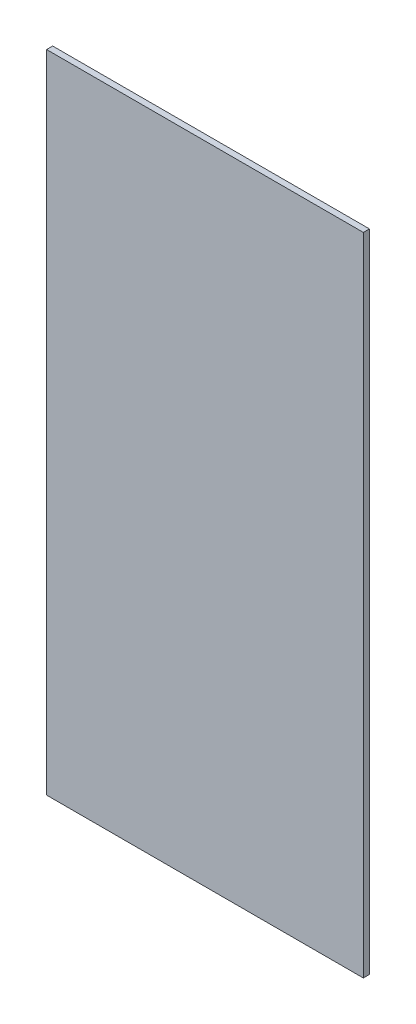
ISO-10303-21;
HEADER;
FILE_DESCRIPTION(('STEP AP214'),'2;1');
FILE_NAME('part.step','',(''),(''),'','','');
FILE_SCHEMA(('AUTOMOTIVE_DESIGN { 1 0 10303 214 1 1 1 1 }'));
ENDSEC;
DATA;
#1=APPLICATION_CONTEXT('core data for automotive mechanical design processes');
#2=APPLICATION_PROTOCOL_DEFINITION('international standard','automotive_design',2000,#1);
#3=PRODUCT_CONTEXT('',#1,'mechanical');
#4=PRODUCT('Part','Part','',(#3));
#5=PRODUCT_RELATED_PRODUCT_CATEGORY('part','',(#4));
#6=PRODUCT_DEFINITION_FORMATION('','',#4);
#7=PRODUCT_DEFINITION_CONTEXT('part definition',#1,'design');
#8=PRODUCT_DEFINITION('design','',#6,#7);
#9=PRODUCT_DEFINITION_SHAPE('','',#8);
#10=(LENGTH_UNIT() NAMED_UNIT(*) SI_UNIT(.MILLI.,.METRE.));
#11=(NAMED_UNIT(*) PLANE_ANGLE_UNIT() SI_UNIT($,.RADIAN.));
#12=(NAMED_UNIT(*) SI_UNIT($,.STERADIAN.) SOLID_ANGLE_UNIT());
#13=UNCERTAINTY_MEASURE_WITH_UNIT(LENGTH_MEASURE(1.E-05),#10,'distance_accuracy_value','');
#14=(GEOMETRIC_REPRESENTATION_CONTEXT(3) GLOBAL_UNCERTAINTY_ASSIGNED_CONTEXT((#13)) GLOBAL_UNIT_ASSIGNED_CONTEXT((#10,
#11,#12)) REPRESENTATION_CONTEXT('',''));
#15=CARTESIAN_POINT('',(0.,0.,0.));
#16=DIRECTION('',(0.,0.,1.));
#17=DIRECTION('',(1.,0.,0.));
#18=AXIS2_PLACEMENT_3D('',#15,#16,#17);
#19=CARTESIAN_POINT('',(0.917030567685551,196.493449781659,3.));
#20=DIRECTION('',(1.,0.,0.));
#21=DIRECTION('',(0.,1.,0.));
#22=AXIS2_PLACEMENT_3D('',#19,#20,#21);
#23=PLANE('',#22);
#24=DIRECTION('',(0.,-1.,0.));
#25=VECTOR('',#24,1.);
#26=CARTESIAN_POINT('',(0.917030567685551,196.493449781659,0.));
#27=LINE('',#26,#25);
#28=CARTESIAN_POINT('',(0.917030567685551,196.493449781659,0.));
#29=VERTEX_POINT('',#28);
#30=CARTESIAN_POINT('',(0.917030567685662,-121.506550218341,0.));
#31=VERTEX_POINT('',#30);
#32=EDGE_CURVE('E98',#29,#31,#27,.T.);
#33=ORIENTED_EDGE('',*,*,#32,.T.);
#34=DIRECTION('',(0.,0.,-1.));
#35=VECTOR('',#34,1.);
#36=CARTESIAN_POINT('',(0.917030567685662,-121.506550218341,3.));
#37=LINE('',#36,#35);
#38=CARTESIAN_POINT('',(0.917030567685662,-121.506550218341,3.));
#39=VERTEX_POINT('',#38);
#40=EDGE_CURVE('E11',#39,#31,#37,.T.);
#41=ORIENTED_EDGE('',*,*,#40,.F.);
#42=DIRECTION('',(0.,-1.,0.));
#43=VECTOR('',#42,1.);
#44=CARTESIAN_POINT('',(0.917030567685551,196.493449781659,3.));
#45=LINE('',#44,#43);
#46=CARTESIAN_POINT('',(0.917030567685551,196.493449781659,3.));
#47=VERTEX_POINT('',#46);
#48=EDGE_CURVE('E86',#47,#39,#45,.T.);
#49=ORIENTED_EDGE('',*,*,#48,.F.);
#50=DIRECTION('',(0.,0.,-1.));
#51=VECTOR('',#50,1.);
#52=CARTESIAN_POINT('',(0.917030567685551,196.493449781659,3.));
#53=LINE('',#52,#51);
#54=EDGE_CURVE('E94',#47,#29,#53,.T.);
#55=ORIENTED_EDGE('',*,*,#54,.T.);
#56=EDGE_LOOP('',(#33,#41,#49,#55));
#57=FACE_BOUND('',#56,.T.);
#58=ADVANCED_FACE('F35',(#57),#23,.F.);
#59=CARTESIAN_POINT('',(0.917030567685662,-121.506550218341,3.));
#60=DIRECTION('',(0.,1.,0.));
#61=DIRECTION('',(-1.,0.,0.));
#62=AXIS2_PLACEMENT_3D('',#59,#60,#61);
#63=PLANE('',#62);
#64=DIRECTION('',(1.,0.,0.));
#65=VECTOR('',#64,1.);
#66=CARTESIAN_POINT('',(0.917030567685662,-121.506550218341,0.));
#67=LINE('',#66,#65);
#68=CARTESIAN_POINT('',(156.917030567686,-121.506550218341,0.));
#69=VERTEX_POINT('',#68);
#70=EDGE_CURVE('E90',#31,#69,#67,.T.);
#71=ORIENTED_EDGE('',*,*,#70,.T.);
#72=DIRECTION('',(0.,0.,-1.));
#73=VECTOR('',#72,1.);
#74=CARTESIAN_POINT('',(156.917030567686,-121.506550218341,3.));
#75=LINE('',#74,#73);
#76=CARTESIAN_POINT('',(156.917030567686,-121.506550218341,3.));
#77=VERTEX_POINT('',#76);
#78=EDGE_CURVE('E43',#77,#69,#75,.T.);
#79=ORIENTED_EDGE('',*,*,#78,.F.);
#80=DIRECTION('',(1.,0.,0.));
#81=VECTOR('',#80,1.);
#82=CARTESIAN_POINT('',(0.917030567685662,-121.506550218341,3.));
#83=LINE('',#82,#81);
#84=EDGE_CURVE('E81',#39,#77,#83,.T.);
#85=ORIENTED_EDGE('',*,*,#84,.F.);
#86=ORIENTED_EDGE('',*,*,#40,.T.);
#87=EDGE_LOOP('',(#71,#79,#85,#86));
#88=FACE_BOUND('',#87,.T.);
#89=ADVANCED_FACE('F89',(#88),#63,.F.);
#90=CARTESIAN_POINT('',(156.917030567686,196.493449781659,3.));
#91=DIRECTION('',(-1.,0.,0.));
#92=DIRECTION('',(0.,0.,1.));
#93=AXIS2_PLACEMENT_3D('',#90,#91,#92);
#94=PLANE('',#93);
#95=DIRECTION('',(0.,1.,0.));
#96=VECTOR('',#95,1.);
#97=CARTESIAN_POINT('',(156.917030567686,196.493449781659,0.));
#98=LINE('',#97,#96);
#99=CARTESIAN_POINT('',(156.917030567686,196.493449781659,0.));
#100=VERTEX_POINT('',#99);
#101=EDGE_CURVE('E68',#69,#100,#98,.T.);
#102=ORIENTED_EDGE('',*,*,#101,.T.);
#103=DIRECTION('',(0.,0.,-1.));
#104=VECTOR('',#103,1.);
#105=CARTESIAN_POINT('',(156.917030567686,196.493449781659,3.));
#106=LINE('',#105,#104);
#107=CARTESIAN_POINT('',(156.917030567686,196.493449781659,3.));
#108=VERTEX_POINT('',#107);
#109=EDGE_CURVE('E91',#108,#100,#106,.T.);
#110=ORIENTED_EDGE('',*,*,#109,.F.);
#111=DIRECTION('',(0.,1.,0.));
#112=VECTOR('',#111,1.);
#113=CARTESIAN_POINT('',(156.917030567686,196.493449781659,3.));
#114=LINE('',#113,#112);
#115=EDGE_CURVE('E84',#77,#108,#114,.T.);
#116=ORIENTED_EDGE('',*,*,#115,.F.);
#117=ORIENTED_EDGE('',*,*,#78,.T.);
#118=EDGE_LOOP('',(#102,#110,#116,#117));
#119=FACE_BOUND('',#118,.T.);
#120=ADVANCED_FACE('F92',(#119),#94,.F.);
#121=CARTESIAN_POINT('',(0.917030567685551,196.493449781659,3.));
#122=DIRECTION('',(0.,-1.,0.));
#123=DIRECTION('',(0.,0.,-1.));
#124=AXIS2_PLACEMENT_3D('',#121,#122,#123);
#125=PLANE('',#124);
#126=DIRECTION('',(-1.,0.,0.));
#127=VECTOR('',#126,1.);
#128=CARTESIAN_POINT('',(0.917030567685551,196.493449781659,0.));
#129=LINE('',#128,#127);
#130=EDGE_CURVE('E74',#100,#29,#129,.T.);
#131=ORIENTED_EDGE('',*,*,#130,.T.);
#132=ORIENTED_EDGE('',*,*,#54,.F.);
#133=DIRECTION('',(-1.,0.,0.));
#134=VECTOR('',#133,1.);
#135=CARTESIAN_POINT('',(0.917030567685551,196.493449781659,3.));
#136=LINE('',#135,#134);
#137=EDGE_CURVE('E51',#108,#47,#136,.T.);
#138=ORIENTED_EDGE('',*,*,#137,.F.);
#139=ORIENTED_EDGE('',*,*,#109,.T.);
#140=EDGE_LOOP('',(#131,#132,#138,#139));
#141=FACE_BOUND('',#140,.T.);
#142=ADVANCED_FACE('F105',(#141),#125,.F.);
#143=CARTESIAN_POINT('',(0.,0.,3.));
#144=DIRECTION('',(0.,0.,1.));
#145=DIRECTION('',(1.,0.,0.));
#146=AXIS2_PLACEMENT_3D('',#143,#144,#145);
#147=PLANE('',#146);
#148=ORIENTED_EDGE('',*,*,#48,.T.);
#149=ORIENTED_EDGE('',*,*,#84,.T.);
#150=ORIENTED_EDGE('',*,*,#115,.T.);
#151=ORIENTED_EDGE('',*,*,#137,.T.);
#152=EDGE_LOOP('',(#148,#149,#150,#151));
#153=FACE_BOUND('',#152,.T.);
#154=ADVANCED_FACE('F82',(#153),#147,.T.);
#155=CARTESIAN_POINT('',(0.,0.,0.));
#156=DIRECTION('',(0.,0.,1.));
#157=DIRECTION('',(1.,0.,0.));
#158=AXIS2_PLACEMENT_3D('',#155,#156,#157);
#159=PLANE('',#158);
#160=ORIENTED_EDGE('',*,*,#32,.F.);
#161=ORIENTED_EDGE('',*,*,#130,.F.);
#162=ORIENTED_EDGE('',*,*,#101,.F.);
#163=ORIENTED_EDGE('',*,*,#70,.F.);
#164=EDGE_LOOP('',(#160,#161,#162,#163));
#165=FACE_BOUND('',#164,.T.);
#166=ADVANCED_FACE('F108',(#165),#159,.F.);
#167=CLOSED_SHELL('',(#58,#89,#120,#142,#154,#166));
#168=MANIFOLD_SOLID_BREP('B2',#167);
#169=ADVANCED_BREP_SHAPE_REPRESENTATION('',(#18,#168),#14);
#170=SHAPE_DEFINITION_REPRESENTATION(#9,#169);
ENDSEC;
END-ISO-10303-21;
